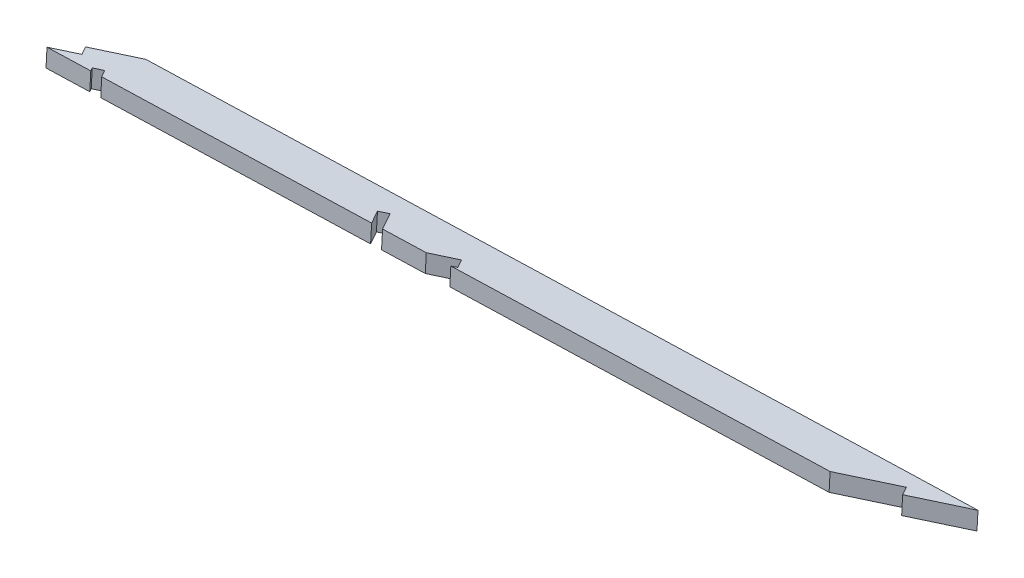
ISO-10303-21;
HEADER;
FILE_DESCRIPTION(('STEP AP214'),'2;1');
FILE_NAME('part.step','',(''),(''),'','','');
FILE_SCHEMA(('AUTOMOTIVE_DESIGN { 1 0 10303 214 1 1 1 1 }'));
ENDSEC;
DATA;
#1=APPLICATION_CONTEXT('core data for automotive mechanical design processes');
#2=APPLICATION_PROTOCOL_DEFINITION('international standard','automotive_design',2000,#1);
#3=PRODUCT_CONTEXT('',#1,'mechanical');
#4=PRODUCT('Part','Part','',(#3));
#5=PRODUCT_RELATED_PRODUCT_CATEGORY('part','',(#4));
#6=PRODUCT_DEFINITION_FORMATION('','',#4);
#7=PRODUCT_DEFINITION_CONTEXT('part definition',#1,'design');
#8=PRODUCT_DEFINITION('design','',#6,#7);
#9=PRODUCT_DEFINITION_SHAPE('','',#8);
#10=(LENGTH_UNIT() NAMED_UNIT(*) SI_UNIT(.MILLI.,.METRE.));
#11=(NAMED_UNIT(*) PLANE_ANGLE_UNIT() SI_UNIT($,.RADIAN.));
#12=(NAMED_UNIT(*) SI_UNIT($,.STERADIAN.) SOLID_ANGLE_UNIT());
#13=UNCERTAINTY_MEASURE_WITH_UNIT(LENGTH_MEASURE(1.E-05),#10,'distance_accuracy_value','');
#14=(GEOMETRIC_REPRESENTATION_CONTEXT(3) GLOBAL_UNCERTAINTY_ASSIGNED_CONTEXT((#13)) GLOBAL_UNIT_ASSIGNED_CONTEXT((#10,
#11,#12)) REPRESENTATION_CONTEXT('',''));
#15=CARTESIAN_POINT('',(0.,0.,0.));
#16=DIRECTION('',(0.,0.,1.));
#17=DIRECTION('',(1.,0.,0.));
#18=AXIS2_PLACEMENT_3D('',#15,#16,#17);
#19=CARTESIAN_POINT('',(-476.829031594388,54.5135369276523,20.0365454704233));
#20=DIRECTION('',(0.874666792562485,-0.0464839809289173,-0.482490664682183));
#21=DIRECTION('',(-0.483012784347191,0.,-0.875613299440554));
#22=AXIS2_PLACEMENT_3D('',#19,#20,#21);
#23=PLANE('',#22);
#24=DIRECTION('',(-0.482064519205945,0.0207217412881315,-0.875890637443242));
#25=VECTOR('',#24,1.);
#26=CARTESIAN_POINT('',(-476.507004486258,60.8553078660013,20.0093442362275));
#27=LINE('',#26,#25);
#28=CARTESIAN_POINT('',(-476.507004486258,60.8553078660013,20.0093442362275));
#29=VERTEX_POINT('',#28);
#30=CARTESIAN_POINT('',(-477.801520862647,60.9109531839537,17.6572632824911));
#31=VERTEX_POINT('',#30);
#32=EDGE_CURVE('E201',#29,#31,#27,.T.);
#33=ORIENTED_EDGE('',*,*,#32,.T.);
#34=DIRECTION('',(0.0507129304142115,0.998704084779364,-0.00428365892847758));
#35=VECTOR('',#34,1.);
#36=CARTESIAN_POINT('',(-478.123547970778,54.5691822456047,17.6844645166869));
#37=LINE('',#36,#35);
#38=CARTESIAN_POINT('',(-478.123547970778,54.5691822456047,17.6844645166869));
#39=VERTEX_POINT('',#38);
#40=EDGE_CURVE('E11',#39,#31,#37,.T.);
#41=ORIENTED_EDGE('',*,*,#40,.F.);
#42=DIRECTION('',(-0.482064519205945,0.0207217412881315,-0.875890637443242));
#43=VECTOR('',#42,1.);
#44=CARTESIAN_POINT('',(-476.829031594388,54.5135369276523,20.0365454704233));
#45=LINE('',#44,#43);
#46=CARTESIAN_POINT('',(-476.829031594388,54.5135369276523,20.0365454704233));
#47=VERTEX_POINT('',#46);
#48=EDGE_CURVE('E239',#47,#39,#45,.T.);
#49=ORIENTED_EDGE('',*,*,#48,.F.);
#50=DIRECTION('',(0.0507129304142115,0.998704084779364,-0.00428365892847758));
#51=VECTOR('',#50,1.);
#52=CARTESIAN_POINT('',(-476.829031594388,54.5135369276523,20.0365454704233));
#53=LINE('',#52,#51);
#54=EDGE_CURVE('E197',#47,#29,#53,.T.);
#55=ORIENTED_EDGE('',*,*,#54,.T.);
#56=EDGE_LOOP('',(#33,#41,#49,#55));
#57=FACE_BOUND('',#56,.T.);
#58=ADVANCED_FACE('F33',(#57),#23,.F.);
#59=CARTESIAN_POINT('',(-478.123547970778,54.5691822456047,17.6844645166869));
#60=DIRECTION('',(-0.482064519205948,0.0207217412881313,-0.87589063744324));
#61=DIRECTION('',(-0.876078747611493,0.,0.482168049525762));
#62=AXIS2_PLACEMENT_3D('',#59,#60,#61);
#63=PLANE('',#62);
#64=DIRECTION('',(-0.874666792562483,0.046483980928915,0.482490664682187));
#65=VECTOR('',#64,1.);
#66=CARTESIAN_POINT('',(-477.801520862647,60.9109531839537,17.6572632824911));
#67=LINE('',#66,#65);
#68=CARTESIAN_POINT('',(-480.578587929033,61.058539823403,19.189171142857));
#69=VERTEX_POINT('',#68);
#70=EDGE_CURVE('E204',#31,#69,#67,.T.);
#71=ORIENTED_EDGE('',*,*,#70,.T.);
#72=DIRECTION('',(0.0507129304142115,0.998704084779364,-0.00428365892847758));
#73=VECTOR('',#72,1.);
#74=CARTESIAN_POINT('',(-480.900615037163,54.716768885054,19.2163723770529));
#75=LINE('',#74,#73);
#76=CARTESIAN_POINT('',(-480.900615037163,54.716768885054,19.2163723770529));
#77=VERTEX_POINT('',#76);
#78=EDGE_CURVE('E41',#77,#69,#75,.T.);
#79=ORIENTED_EDGE('',*,*,#78,.F.);
#80=DIRECTION('',(-0.874666792562483,0.046483980928915,0.482490664682187));
#81=VECTOR('',#80,1.);
#82=CARTESIAN_POINT('',(-478.123547970778,54.5691822456047,17.6844645166869));
#83=LINE('',#82,#81);
#84=EDGE_CURVE('E128',#39,#77,#83,.T.);
#85=ORIENTED_EDGE('',*,*,#84,.F.);
#86=ORIENTED_EDGE('',*,*,#40,.T.);
#87=EDGE_LOOP('',(#71,#79,#85,#86));
#88=FACE_BOUND('',#87,.T.);
#89=ADVANCED_FACE('F357',(#88),#63,.F.);
#90=CARTESIAN_POINT('',(-480.900615037163,54.716768885054,19.2163723770529));
#91=DIRECTION('',(-0.874666792562497,0.0464839809289178,0.482490664682161));
#92=DIRECTION('',(0.483012784347168,0.,0.875613299440567));
#93=AXIS2_PLACEMENT_3D('',#90,#91,#92);
#94=PLANE('',#93);
#95=DIRECTION('',(0.482064519205922,-0.020721741288132,0.875890637443255));
#96=VECTOR('',#95,1.);
#97=CARTESIAN_POINT('',(-480.578587929033,61.058539823403,19.189171142857));
#98=LINE('',#97,#96);
#99=CARTESIAN_POINT('',(-479.966365989642,61.032223211967,20.30155225241));
#100=VERTEX_POINT('',#99);
#101=EDGE_CURVE('E206',#69,#100,#98,.T.);
#102=ORIENTED_EDGE('',*,*,#101,.T.);
#103=DIRECTION('',(0.0507129304142115,0.998704084779364,-0.00428365892847758));
#104=VECTOR('',#103,1.);
#105=CARTESIAN_POINT('',(-480.288393097772,54.6904522736181,20.3287534866058));
#106=LINE('',#105,#104);
#107=CARTESIAN_POINT('',(-480.288393097772,54.6904522736181,20.3287534866058));
#108=VERTEX_POINT('',#107);
#109=EDGE_CURVE('E282',#108,#100,#106,.T.);
#110=ORIENTED_EDGE('',*,*,#109,.F.);
#111=DIRECTION('',(0.482064519205922,-0.020721741288132,0.875890637443255));
#112=VECTOR('',#111,1.);
#113=CARTESIAN_POINT('',(-480.900615037163,54.716768885054,19.2163723770529));
#114=LINE('',#113,#112);
#115=EDGE_CURVE('E290',#77,#108,#114,.T.);
#116=ORIENTED_EDGE('',*,*,#115,.F.);
#117=ORIENTED_EDGE('',*,*,#78,.T.);
#118=EDGE_LOOP('',(#102,#110,#116,#117));
#119=FACE_BOUND('',#118,.T.);
#120=ADVANCED_FACE('F288',(#119),#94,.F.);
#121=CARTESIAN_POINT('',(-480.288393097772,54.6904522736181,20.3287534866058));
#122=DIRECTION('',(-0.0841690332483842,0.,-0.996451490962823));
#123=DIRECTION('',(-0.996451490962823,0.,0.0841690332483842));
#124=AXIS2_PLACEMENT_3D('',#121,#122,#123);
#125=PLANE('',#124);
#126=DIRECTION('',(-0.995160174309058,0.0508935265531112,0.0840599573170965));
#127=VECTOR('',#126,1.);
#128=CARTESIAN_POINT('',(-479.966365989642,61.032223211967,20.30155225241));
#129=LINE('',#128,#127);
#130=CARTESIAN_POINT('',(-493.817067471883,61.7405624942892,21.4715039902972));
#131=VERTEX_POINT('',#130);
#132=EDGE_CURVE('E208',#100,#131,#129,.T.);
#133=ORIENTED_EDGE('',*,*,#132,.T.);
#134=DIRECTION('',(0.0507129304142115,0.998704084779364,-0.00428365892847758));
#135=VECTOR('',#134,1.);
#136=CARTESIAN_POINT('',(-494.139094580013,55.3987915559402,21.4987052244931));
#137=LINE('',#136,#135);
#138=CARTESIAN_POINT('',(-494.139094580013,55.3987915559402,21.4987052244931));
#139=VERTEX_POINT('',#138);
#140=EDGE_CURVE('E279',#139,#131,#137,.T.);
#141=ORIENTED_EDGE('',*,*,#140,.F.);
#142=DIRECTION('',(-0.995160174309058,0.0508935265531112,0.0840599573170965));
#143=VECTOR('',#142,1.);
#144=CARTESIAN_POINT('',(-480.288393097772,54.6904522736181,20.3287534866058));
#145=LINE('',#144,#143);
#146=EDGE_CURVE('E308',#108,#139,#145,.T.);
#147=ORIENTED_EDGE('',*,*,#146,.F.);
#148=ORIENTED_EDGE('',*,*,#109,.T.);
#149=EDGE_LOOP('',(#133,#141,#147,#148));
#150=FACE_BOUND('',#149,.T.);
#151=ADVANCED_FACE('F299',(#150),#125,.F.);
#152=CARTESIAN_POINT('',(-494.139094580013,55.3987915559402,21.4987052244931));
#153=DIRECTION('',(0.482064519205941,-0.0207217412881309,0.875890637443244));
#154=DIRECTION('',(0.876078747611497,0.,-0.482168049525755));
#155=AXIS2_PLACEMENT_3D('',#152,#153,#154);
#156=PLANE('',#155);
#157=DIRECTION('',(0.874666792562487,-0.0464839809289173,-0.48249066468218));
#158=VECTOR('',#157,1.);
#159=CARTESIAN_POINT('',(-493.817067471883,61.7405624942892,21.4715039902972));
#160=LINE('',#159,#158);
#161=CARTESIAN_POINT('',(-486.093084044152,61.3300730354427,17.210738714046));
#162=VERTEX_POINT('',#161);
#163=EDGE_CURVE('E210',#131,#162,#160,.T.);
#164=ORIENTED_EDGE('',*,*,#163,.T.);
#165=DIRECTION('',(0.0507129304142115,0.998704084779364,-0.00428365892847758));
#166=VECTOR('',#165,1.);
#167=CARTESIAN_POINT('',(-486.415111152282,54.9883020970938,17.2379399482418));
#168=LINE('',#167,#166);
#169=CARTESIAN_POINT('',(-486.415111152282,54.9883020970938,17.2379399482418));
#170=VERTEX_POINT('',#169);
#171=EDGE_CURVE('E276',#170,#162,#168,.T.);
#172=ORIENTED_EDGE('',*,*,#171,.F.);
#173=DIRECTION('',(0.874666792562487,-0.0464839809289173,-0.48249066468218));
#174=VECTOR('',#173,1.);
#175=CARTESIAN_POINT('',(-494.139094580013,55.3987915559402,21.4987052244931));
#176=LINE('',#175,#174);
#177=EDGE_CURVE('E305',#139,#170,#176,.T.);
#178=ORIENTED_EDGE('',*,*,#177,.F.);
#179=ORIENTED_EDGE('',*,*,#140,.T.);
#180=EDGE_LOOP('',(#164,#172,#178,#179));
#181=FACE_BOUND('',#180,.T.);
#182=ADVANCED_FACE('F303',(#181),#156,.F.);
#183=CARTESIAN_POINT('',(-486.415111152282,54.9883020970938,17.2379399482418));
#184=DIRECTION('',(0.874666792562486,-0.0464839809289173,-0.482490664682182));
#185=DIRECTION('',(-0.48301278434719,0.,-0.875613299440555));
#186=AXIS2_PLACEMENT_3D('',#183,#184,#185);
#187=PLANE('',#186);
#188=DIRECTION('',(-0.482064519205943,0.0207217412881325,-0.875890637443243));
#189=VECTOR('',#188,1.);
#190=CARTESIAN_POINT('',(-486.093084044152,61.3300730354427,17.210738714046));
#191=LINE('',#190,#189);
#192=CARTESIAN_POINT('',(-487.62363889263,61.3958645640325,14.4297859401637));
#193=VERTEX_POINT('',#192);
#194=EDGE_CURVE('E212',#162,#193,#191,.T.);
#195=ORIENTED_EDGE('',*,*,#194,.T.);
#196=DIRECTION('',(0.0507129304142115,0.998704084779364,-0.00428365892847758));
#197=VECTOR('',#196,1.);
#198=CARTESIAN_POINT('',(-487.945666000761,55.0540936256836,14.4569871743595));
#199=LINE('',#198,#197);
#200=CARTESIAN_POINT('',(-487.945666000761,55.0540936256836,14.4569871743595));
#201=VERTEX_POINT('',#200);
#202=EDGE_CURVE('E273',#201,#193,#199,.T.);
#203=ORIENTED_EDGE('',*,*,#202,.F.);
#204=DIRECTION('',(-0.482064519205943,0.0207217412881325,-0.875890637443243));
#205=VECTOR('',#204,1.);
#206=CARTESIAN_POINT('',(-486.415111152282,54.9883020970938,17.2379399482418));
#207=LINE('',#206,#205);
#208=EDGE_CURVE('E307',#170,#201,#207,.T.);
#209=ORIENTED_EDGE('',*,*,#208,.F.);
#210=ORIENTED_EDGE('',*,*,#171,.T.);
#211=EDGE_LOOP('',(#195,#203,#209,#210));
#212=FACE_BOUND('',#211,.T.);
#213=ADVANCED_FACE('F370',(#212),#187,.F.);
#214=CARTESIAN_POINT('',(-487.945666000761,55.0540936256836,14.4569871743595));
#215=DIRECTION('',(0.482030970264136,-0.0207199583403463,0.875909143137911));
#216=DIRECTION('',(0.876097224899921,0.,-0.482134475559109));
#217=AXIS2_PLACEMENT_3D('',#214,#215,#216);
#218=PLANE('',#217);
#219=DIRECTION('',(0.874685281912883,-0.0464847756946999,-0.482457068798452));
#220=VECTOR('',#219,1.);
#221=CARTESIAN_POINT('',(-487.62363889263,61.3958645640325,14.4297859401637));
#222=LINE('',#221,#220);
#223=CARTESIAN_POINT('',(-474.293435186474,60.6874365819243,7.07714020626748));
#224=VERTEX_POINT('',#223);
#225=EDGE_CURVE('E214',#193,#224,#222,.T.);
#226=ORIENTED_EDGE('',*,*,#225,.T.);
#227=DIRECTION('',(0.0507129304142115,0.998704084779364,-0.00428365892847758));
#228=VECTOR('',#227,1.);
#229=CARTESIAN_POINT('',(-474.615462294604,54.3456656435753,7.10434144046332));
#230=LINE('',#229,#228);
#231=CARTESIAN_POINT('',(-474.615462294604,54.3456656435753,7.10434144046332));
#232=VERTEX_POINT('',#231);
#233=EDGE_CURVE('E270',#232,#224,#230,.T.);
#234=ORIENTED_EDGE('',*,*,#233,.F.);
#235=DIRECTION('',(0.874685281912883,-0.0464847756946999,-0.482457068798452));
#236=VECTOR('',#235,1.);
#237=CARTESIAN_POINT('',(-487.945666000761,55.0540936256836,14.4569871743595));
#238=LINE('',#237,#236);
#239=EDGE_CURVE('E310',#201,#232,#238,.T.);
#240=ORIENTED_EDGE('',*,*,#239,.F.);
#241=ORIENTED_EDGE('',*,*,#202,.T.);
#242=EDGE_LOOP('',(#226,#234,#240,#241));
#243=FACE_BOUND('',#242,.T.);
#244=ADVANCED_FACE('F373',(#243),#218,.F.);
#245=CARTESIAN_POINT('',(-474.615462294604,54.3456656435753,7.10434144046332));
#246=DIRECTION('',(0.084169033251768,-2.72252662951401E-13,0.996451490962537));
#247=DIRECTION('',(0.996451490962537,0.,-0.084169033251768));
#248=AXIS2_PLACEMENT_3D('',#245,#246,#247);
#249=PLANE('',#248);
#250=DIRECTION('',(0.995160174308772,-0.0508935265531107,-0.0840599573204847));
#251=VECTOR('',#250,1.);
#252=CARTESIAN_POINT('',(-474.293435186474,60.6874365819243,7.07714020626748));
#253=LINE('',#252,#251);
#254=CARTESIAN_POINT('',(-210.988565112463,47.221751617207,-15.1638986858593));
#255=VERTEX_POINT('',#254);
#256=EDGE_CURVE('E216',#224,#255,#253,.T.);
#257=ORIENTED_EDGE('',*,*,#256,.T.);
#258=DIRECTION('',(0.0507129304142115,0.998704084779364,-0.00428365892847758));
#259=VECTOR('',#258,1.);
#260=CARTESIAN_POINT('',(-211.310592220593,40.8799806788581,-15.1366974516635));
#261=LINE('',#260,#259);
#262=CARTESIAN_POINT('',(-211.310592220593,40.8799806788581,-15.1366974516635));
#263=VERTEX_POINT('',#262);
#264=EDGE_CURVE('E267',#263,#255,#261,.T.);
#265=ORIENTED_EDGE('',*,*,#264,.F.);
#266=DIRECTION('',(0.995160174308772,-0.0508935265531107,-0.0840599573204847));
#267=VECTOR('',#266,1.);
#268=CARTESIAN_POINT('',(-474.615462294604,54.3456656435753,7.10434144046332));
#269=LINE('',#268,#267);
#270=EDGE_CURVE('E316',#232,#263,#269,.T.);
#271=ORIENTED_EDGE('',*,*,#270,.F.);
#272=ORIENTED_EDGE('',*,*,#233,.T.);
#273=EDGE_LOOP('',(#257,#265,#271,#272));
#274=FACE_BOUND('',#273,.T.);
#275=ADVANCED_FACE('F377',(#274),#249,.F.);
#276=CARTESIAN_POINT('',(-211.310592220593,40.8799806788581,-15.1366974516635));
#277=DIRECTION('',(-0.482031673726719,0.0207199957255664,-0.875908755123129));
#278=DIRECTION('',(-0.876096837480756,0.,0.482135179546378));
#279=AXIS2_PLACEMENT_3D('',#276,#277,#278);
#280=PLANE('',#279);
#281=DIRECTION('',(-0.87468489424079,0.0464847590307264,0.482457773245322));
#282=VECTOR('',#281,1.);
#283=CARTESIAN_POINT('',(-210.988565112463,47.221751617207,-15.1638986858593));
#284=LINE('',#283,#282);
#285=CARTESIAN_POINT('',(-227.65131234775,48.1072862767424,-5.97307810553605));
#286=VERTEX_POINT('',#285);
#287=EDGE_CURVE('E218',#255,#286,#284,.T.);
#288=ORIENTED_EDGE('',*,*,#287,.T.);
#289=DIRECTION('',(0.0507129304142115,0.998704084779364,-0.00428365892847758));
#290=VECTOR('',#289,1.);
#291=CARTESIAN_POINT('',(-227.97333945588,41.7655153383934,-5.94587687134022));
#292=LINE('',#291,#290);
#293=CARTESIAN_POINT('',(-227.97333945588,41.7655153383934,-5.94587687134022));
#294=VERTEX_POINT('',#293);
#295=EDGE_CURVE('E264',#294,#286,#292,.T.);
#296=ORIENTED_EDGE('',*,*,#295,.F.);
#297=DIRECTION('',(-0.87468489424079,0.0464847590307264,0.482457773245322));
#298=VECTOR('',#297,1.);
#299=CARTESIAN_POINT('',(-211.310592220593,40.8799806788581,-15.1366974516635));
#300=LINE('',#299,#298);
#301=EDGE_CURVE('E318',#263,#294,#300,.T.);
#302=ORIENTED_EDGE('',*,*,#301,.F.);
#303=ORIENTED_EDGE('',*,*,#264,.T.);
#304=EDGE_LOOP('',(#288,#296,#302,#303));
#305=FACE_BOUND('',#304,.T.);
#306=ADVANCED_FACE('F381',(#305),#280,.F.);
#307=CARTESIAN_POINT('',(-227.97333945588,41.7655153383934,-5.94587687134022));
#308=DIRECTION('',(0.874684894240787,-0.0464847590307262,-0.482457773245326));
#309=DIRECTION('',(-0.482979874824389,0.,-0.8756314524471));
#310=AXIS2_PLACEMENT_3D('',#307,#308,#309);
#311=PLANE('',#310);
#312=DIRECTION('',(-0.482031673726724,0.0207199957255664,-0.875908755123127));
#313=VECTOR('',#312,1.);
#314=CARTESIAN_POINT('',(-227.65131234775,48.1072862767424,-5.97307810553605));
#315=LINE('',#314,#313);
#316=CARTESIAN_POINT('',(-229.181762911832,48.173072263171,-8.75408840305199));
#317=VERTEX_POINT('',#316);
#318=EDGE_CURVE('E220',#286,#317,#315,.T.);
#319=ORIENTED_EDGE('',*,*,#318,.T.);
#320=DIRECTION('',(0.0507129304142115,0.998704084779364,-0.00428365892847758));
#321=VECTOR('',#320,1.);
#322=CARTESIAN_POINT('',(-229.503790019963,41.8313013248221,-8.72688716885616));
#323=LINE('',#322,#321);
#324=CARTESIAN_POINT('',(-229.503790019963,41.8313013248221,-8.72688716885616));
#325=VERTEX_POINT('',#324);
#326=EDGE_CURVE('E261',#325,#317,#323,.T.);
#327=ORIENTED_EDGE('',*,*,#326,.F.);
#328=DIRECTION('',(-0.482031673726724,0.0207199957255664,-0.875908755123127));
#329=VECTOR('',#328,1.);
#330=CARTESIAN_POINT('',(-227.97333945588,41.7655153383934,-5.94587687134022));
#331=LINE('',#330,#329);
#332=EDGE_CURVE('E320',#294,#325,#331,.T.);
#333=ORIENTED_EDGE('',*,*,#332,.F.);
#334=ORIENTED_EDGE('',*,*,#295,.T.);
#335=EDGE_LOOP('',(#319,#327,#333,#334));
#336=FACE_BOUND('',#335,.T.);
#337=ADVANCED_FACE('F385',(#336),#311,.F.);
#338=CARTESIAN_POINT('',(-229.503790019963,41.8313013248221,-8.72688716885616));
#339=DIRECTION('',(-0.482031673726722,0.0207199957255665,-0.875908755123128));
#340=DIRECTION('',(-0.876096837480755,0.,0.482135179546381));
#341=AXIS2_PLACEMENT_3D('',#338,#339,#340);
#342=PLANE('',#341);
#343=DIRECTION('',(-0.874684894240788,0.0464847590307265,0.482457773245324));
#344=VECTOR('',#343,1.);
#345=CARTESIAN_POINT('',(-229.181762911832,48.173072263171,-8.75408840305199));
#346=LINE('',#345,#344);
#347=CARTESIAN_POINT('',(-246.034689140757,49.0687139049467,0.541630906394031));
#348=VERTEX_POINT('',#347);
#349=EDGE_CURVE('E222',#317,#348,#346,.T.);
#350=ORIENTED_EDGE('',*,*,#349,.T.);
#351=DIRECTION('',(0.0507129304142115,0.998704084779364,-0.00428365892847758));
#352=VECTOR('',#351,1.);
#353=CARTESIAN_POINT('',(-246.356716248887,42.7269429665977,0.568832140589863));
#354=LINE('',#353,#352);
#355=CARTESIAN_POINT('',(-246.356716248887,42.7269429665977,0.568832140589863));
#356=VERTEX_POINT('',#355);
#357=EDGE_CURVE('E258',#356,#348,#354,.T.);
#358=ORIENTED_EDGE('',*,*,#357,.F.);
#359=DIRECTION('',(-0.874684894240788,0.0464847590307265,0.482457773245324));
#360=VECTOR('',#359,1.);
#361=CARTESIAN_POINT('',(-229.503790019963,41.8313013248221,-8.72688716885616));
#362=LINE('',#361,#360);
#363=EDGE_CURVE('E322',#325,#356,#362,.T.);
#364=ORIENTED_EDGE('',*,*,#363,.F.);
#365=ORIENTED_EDGE('',*,*,#326,.T.);
#366=EDGE_LOOP('',(#350,#358,#364,#365));
#367=FACE_BOUND('',#366,.T.);
#368=ADVANCED_FACE('F389',(#367),#342,.F.);
#369=CARTESIAN_POINT('',(-246.356716248887,42.7269429665977,0.568832140589863));
#370=DIRECTION('',(-0.0841690332483866,0.,-0.996451490962823));
#371=DIRECTION('',(-0.996451490962823,0.,0.0841690332483866));
#372=AXIS2_PLACEMENT_3D('',#369,#370,#371);
#373=PLANE('',#372);
#374=DIRECTION('',(-0.995160174309058,0.0508935265531106,0.0840599573170989));
#375=VECTOR('',#374,1.);
#376=CARTESIAN_POINT('',(-246.034689140757,49.0687139049467,0.541630906394031));
#377=LINE('',#376,#375);
#378=CARTESIAN_POINT('',(-366.045630404713,55.20619828541,10.6788076751862));
#379=VERTEX_POINT('',#378);
#380=EDGE_CURVE('E224',#348,#379,#377,.T.);
#381=ORIENTED_EDGE('',*,*,#380,.T.);
#382=DIRECTION('',(0.0507129304142115,0.998704084779364,-0.00428365892847758));
#383=VECTOR('',#382,1.);
#384=CARTESIAN_POINT('',(-366.367657512843,48.864427347061,10.7060089093821));
#385=LINE('',#384,#383);
#386=CARTESIAN_POINT('',(-366.367657512843,48.864427347061,10.7060089093821));
#387=VERTEX_POINT('',#386);
#388=EDGE_CURVE('E255',#387,#379,#385,.T.);
#389=ORIENTED_EDGE('',*,*,#388,.F.);
#390=DIRECTION('',(-0.995160174309058,0.0508935265531106,0.0840599573170989));
#391=VECTOR('',#390,1.);
#392=CARTESIAN_POINT('',(-246.356716248887,42.7269429665977,0.568832140589863));
#393=LINE('',#392,#391);
#394=EDGE_CURVE('E324',#356,#387,#393,.T.);
#395=ORIENTED_EDGE('',*,*,#394,.F.);
#396=ORIENTED_EDGE('',*,*,#357,.T.);
#397=EDGE_LOOP('',(#381,#389,#395,#396));
#398=FACE_BOUND('',#397,.T.);
#399=ADVANCED_FACE('F393',(#398),#373,.F.);
#400=CARTESIAN_POINT('',(-366.367657512843,48.864427347061,10.7060089093821));
#401=DIRECTION('',(0.482064519205951,-0.0207217412881314,0.875890637443239));
#402=DIRECTION('',(0.876078747611492,0.,-0.482168049525765));
#403=AXIS2_PLACEMENT_3D('',#400,#401,#402);
#404=PLANE('',#403);
#405=DIRECTION('',(0.874666792562481,-0.0464839809289171,-0.48249066468219));
#406=VECTOR('',#405,1.);
#407=CARTESIAN_POINT('',(-366.045630404713,55.20619828541,10.6788076751862));
#408=LINE('',#407,#406);
#409=CARTESIAN_POINT('',(-364.499489575521,55.1240289594121,9.82591315270896));
#410=VERTEX_POINT('',#409);
#411=EDGE_CURVE('E226',#379,#410,#408,.T.);
#412=ORIENTED_EDGE('',*,*,#411,.T.);
#413=DIRECTION('',(0.0507129304142115,0.998704084779364,-0.00428365892847758));
#414=VECTOR('',#413,1.);
#415=CARTESIAN_POINT('',(-364.821516683651,48.7822580210631,9.85311438690479));
#416=LINE('',#415,#414);
#417=CARTESIAN_POINT('',(-364.821516683651,48.7822580210631,9.85311438690479));
#418=VERTEX_POINT('',#417);
#419=EDGE_CURVE('E252',#418,#410,#416,.T.);
#420=ORIENTED_EDGE('',*,*,#419,.F.);
#421=DIRECTION('',(0.874666792562481,-0.0464839809289171,-0.48249066468219));
#422=VECTOR('',#421,1.);
#423=CARTESIAN_POINT('',(-366.367657512843,48.864427347061,10.7060089093821));
#424=LINE('',#423,#422);
#425=EDGE_CURVE('E326',#387,#418,#424,.T.);
#426=ORIENTED_EDGE('',*,*,#425,.F.);
#427=ORIENTED_EDGE('',*,*,#388,.T.);
#428=EDGE_LOOP('',(#412,#420,#426,#427));
#429=FACE_BOUND('',#428,.T.);
#430=ADVANCED_FACE('F397',(#429),#404,.F.);
#431=CARTESIAN_POINT('',(-364.821516683651,48.7822580210631,9.85311438690479));
#432=DIRECTION('',(0.874666792562482,-0.0464839809289172,-0.482490664682189));
#433=DIRECTION('',(-0.483012784347197,0.,-0.875613299440551));
#434=AXIS2_PLACEMENT_3D('',#431,#432,#433);
#435=PLANE('',#434);
#436=DIRECTION('',(-0.48206451920595,0.0207217412881328,-0.875890637443239));
#437=VECTOR('',#436,1.);
#438=CARTESIAN_POINT('',(-364.499489575521,55.1240289594121,9.82591315270896));
#439=LINE('',#438,#437);
#440=CARTESIAN_POINT('',(-366.030044424,55.1898204880019,7.04496037882674));
#441=VERTEX_POINT('',#440);
#442=EDGE_CURVE('E228',#410,#441,#439,.T.);
#443=ORIENTED_EDGE('',*,*,#442,.T.);
#444=DIRECTION('',(0.0507129304142115,0.998704084779364,-0.00428365892847758));
#445=VECTOR('',#444,1.);
#446=CARTESIAN_POINT('',(-366.35207153213,48.8480495496529,7.07216161302257));
#447=LINE('',#446,#445);
#448=CARTESIAN_POINT('',(-366.35207153213,48.8480495496529,7.07216161302257));
#449=VERTEX_POINT('',#448);
#450=EDGE_CURVE('E249',#449,#441,#447,.T.);
#451=ORIENTED_EDGE('',*,*,#450,.F.);
#452=DIRECTION('',(-0.48206451920595,0.0207217412881328,-0.875890637443239));
#453=VECTOR('',#452,1.);
#454=CARTESIAN_POINT('',(-364.821516683651,48.7822580210631,9.85311438690479));
#455=LINE('',#454,#453);
#456=EDGE_CURVE('E328',#418,#449,#455,.T.);
#457=ORIENTED_EDGE('',*,*,#456,.F.);
#458=ORIENTED_EDGE('',*,*,#419,.T.);
#459=EDGE_LOOP('',(#443,#451,#457,#458));
#460=FACE_BOUND('',#459,.T.);
#461=ADVANCED_FACE('F401',(#460),#435,.F.);
#462=CARTESIAN_POINT('',(-366.35207153213,48.8480495496529,7.07216161302257));
#463=DIRECTION('',(-0.482064519205936,0.0207217412881306,-0.875890637443247));
#464=DIRECTION('',(-0.8760787476115,0.,0.48216804952575));
#465=AXIS2_PLACEMENT_3D('',#462,#463,#464);
#466=PLANE('',#465);
#467=DIRECTION('',(-0.87466679256249,0.0464839809289169,0.482490664682175));
#468=VECTOR('',#467,1.);
#469=CARTESIAN_POINT('',(-366.030044424,55.1898204880019,7.04496037882674));
#470=LINE('',#469,#468);
#471=CARTESIAN_POINT('',(-373.80583220988,55.60306307846,11.3343023878513));
#472=VERTEX_POINT('',#471);
#473=EDGE_CURVE('E230',#441,#472,#470,.T.);
#474=ORIENTED_EDGE('',*,*,#473,.T.);
#475=DIRECTION('',(0.0507129304142115,0.998704084779364,-0.00428365892847758));
#476=VECTOR('',#475,1.);
#477=CARTESIAN_POINT('',(-374.12785931801,49.261292140111,11.3615036220471));
#478=LINE('',#477,#476);
#479=CARTESIAN_POINT('',(-374.12785931801,49.261292140111,11.3615036220471));
#480=VERTEX_POINT('',#479);
#481=EDGE_CURVE('E246',#480,#472,#478,.T.);
#482=ORIENTED_EDGE('',*,*,#481,.F.);
#483=DIRECTION('',(-0.87466679256249,0.0464839809289169,0.482490664682175));
#484=VECTOR('',#483,1.);
#485=CARTESIAN_POINT('',(-366.35207153213,48.8480495496529,7.07216161302257));
#486=LINE('',#485,#484);
#487=EDGE_CURVE('E330',#449,#480,#486,.T.);
#488=ORIENTED_EDGE('',*,*,#487,.F.);
#489=ORIENTED_EDGE('',*,*,#450,.T.);
#490=EDGE_LOOP('',(#474,#482,#488,#489));
#491=FACE_BOUND('',#490,.T.);
#492=ADVANCED_FACE('F405',(#491),#466,.F.);
#493=CARTESIAN_POINT('',(-374.12785931801,49.261292140111,11.3615036220471));
#494=DIRECTION('',(-0.0841690332483885,0.,-0.996451490962822));
#495=DIRECTION('',(-0.996451490962822,0.,0.0841690332483885));
#496=AXIS2_PLACEMENT_3D('',#493,#494,#495);
#497=PLANE('',#496);
#498=DIRECTION('',(-0.995160174309058,0.0508935265531109,0.0840599573171008));
#499=VECTOR('',#498,1.);
#500=CARTESIAN_POINT('',(-373.80583220988,55.60306307846,11.3343023878513));
#501=LINE('',#500,#499);
#502=CARTESIAN_POINT('',(-387.643278223415,56.3107244623231,12.503134452582));
#503=VERTEX_POINT('',#502);
#504=EDGE_CURVE('E232',#472,#503,#501,.T.);
#505=ORIENTED_EDGE('',*,*,#504,.T.);
#506=DIRECTION('',(0.0507129304142115,0.998704084779364,-0.00428365892847758));
#507=VECTOR('',#506,1.);
#508=CARTESIAN_POINT('',(-387.965305331545,49.9689535239742,12.5303356867778));
#509=LINE('',#508,#507);
#510=CARTESIAN_POINT('',(-387.965305331545,49.9689535239742,12.5303356867778));
#511=VERTEX_POINT('',#510);
#512=EDGE_CURVE('E243',#511,#503,#509,.T.);
#513=ORIENTED_EDGE('',*,*,#512,.F.);
#514=DIRECTION('',(-0.995160174309058,0.0508935265531109,0.0840599573171008));
#515=VECTOR('',#514,1.);
#516=CARTESIAN_POINT('',(-374.12785931801,49.261292140111,11.3615036220471));
#517=LINE('',#516,#515);
#518=EDGE_CURVE('E332',#480,#511,#517,.T.);
#519=ORIENTED_EDGE('',*,*,#518,.F.);
#520=ORIENTED_EDGE('',*,*,#481,.T.);
#521=EDGE_LOOP('',(#505,#513,#519,#520));
#522=FACE_BOUND('',#521,.T.);
#523=ADVANCED_FACE('F338',(#522),#497,.F.);
#524=CARTESIAN_POINT('',(-387.965305331545,49.9689535239742,12.5303356867778));
#525=DIRECTION('',(0.874666792562481,-0.0464839809289171,-0.482490664682191));
#526=DIRECTION('',(-0.483012784347199,0.,-0.87561329944055));
#527=AXIS2_PLACEMENT_3D('',#524,#525,#526);
#528=PLANE('',#527);
#529=DIRECTION('',(-0.482064519205952,0.0207217412881312,-0.875890637443238));
#530=VECTOR('',#529,1.);
#531=CARTESIAN_POINT('',(-387.643278223415,56.3107244623231,12.503134452582));
#532=LINE('',#531,#530);
#533=CARTESIAN_POINT('',(-390.774460417979,56.4453196145833,6.81391017018697));
#534=VERTEX_POINT('',#533);
#535=EDGE_CURVE('E234',#503,#534,#532,.T.);
#536=ORIENTED_EDGE('',*,*,#535,.T.);
#537=DIRECTION('',(0.0507129304142115,0.998704084779364,-0.00428365892847758));
#538=VECTOR('',#537,1.);
#539=CARTESIAN_POINT('',(-391.096487526109,50.1035486762343,6.8411114043828));
#540=LINE('',#539,#538);
#541=CARTESIAN_POINT('',(-391.096487526109,50.1035486762343,6.8411114043828));
#542=VERTEX_POINT('',#541);
#543=EDGE_CURVE('E192',#542,#534,#540,.T.);
#544=ORIENTED_EDGE('',*,*,#543,.F.);
#545=DIRECTION('',(-0.482064519205952,0.0207217412881312,-0.875890637443238));
#546=VECTOR('',#545,1.);
#547=CARTESIAN_POINT('',(-387.965305331545,49.9689535239742,12.5303356867778));
#548=LINE('',#547,#546);
#549=EDGE_CURVE('E183',#511,#542,#548,.T.);
#550=ORIENTED_EDGE('',*,*,#549,.F.);
#551=ORIENTED_EDGE('',*,*,#512,.T.);
#552=EDGE_LOOP('',(#536,#544,#550,#551));
#553=FACE_BOUND('',#552,.T.);
#554=ADVANCED_FACE('F342',(#553),#528,.F.);
#555=CARTESIAN_POINT('',(-391.096487526109,50.1035486762343,6.8411114043828));
#556=DIRECTION('',(-0.482064519205977,0.0207217412881328,-0.875890637443224));
#557=DIRECTION('',(-0.876078747611477,0.,0.482168049525791));
#558=AXIS2_PLACEMENT_3D('',#555,#556,#557);
#559=PLANE('',#558);
#560=DIRECTION('',(-0.874666792562467,0.046483980928917,0.482490664682216));
#561=VECTOR('',#560,1.);
#562=CARTESIAN_POINT('',(-390.774460417979,56.4453196145833,6.81391017018697));
#563=LINE('',#562,#561);
#564=CARTESIAN_POINT('',(-393.551527484364,56.5929062540326,8.34581803055293));
#565=VERTEX_POINT('',#564);
#566=EDGE_CURVE('E191',#534,#565,#563,.T.);
#567=ORIENTED_EDGE('',*,*,#566,.T.);
#568=DIRECTION('',(0.0507129304142115,0.998704084779364,-0.00428365892847758));
#569=VECTOR('',#568,1.);
#570=CARTESIAN_POINT('',(-393.873554592494,50.2511353156836,8.37301926474876));
#571=LINE('',#570,#569);
#572=CARTESIAN_POINT('',(-393.873554592494,50.2511353156836,8.37301926474876));
#573=VERTEX_POINT('',#572);
#574=EDGE_CURVE('E188',#573,#565,#571,.T.);
#575=ORIENTED_EDGE('',*,*,#574,.F.);
#576=DIRECTION('',(-0.874666792562467,0.046483980928917,0.482490664682216));
#577=VECTOR('',#576,1.);
#578=CARTESIAN_POINT('',(-391.096487526109,50.1035486762343,6.8411114043828));
#579=LINE('',#578,#577);
#580=EDGE_CURVE('E177',#542,#573,#579,.T.);
#581=ORIENTED_EDGE('',*,*,#580,.F.);
#582=ORIENTED_EDGE('',*,*,#543,.T.);
#583=EDGE_LOOP('',(#567,#575,#581,#582));
#584=FACE_BOUND('',#583,.T.);
#585=ADVANCED_FACE('F189',(#584),#559,.F.);
#586=CARTESIAN_POINT('',(-393.873554592494,50.2511353156836,8.37301926474876));
#587=DIRECTION('',(-0.874666792562492,0.0464839809289176,0.48249066468217));
#588=DIRECTION('',(0.483012784347178,0.,0.875613299440562));
#589=AXIS2_PLACEMENT_3D('',#586,#587,#588);
#590=PLANE('',#589);
#591=DIRECTION('',(0.482064519205931,-0.0207217412881296,0.87589063744325));
#592=VECTOR('',#591,1.);
#593=CARTESIAN_POINT('',(-393.551527484364,56.5929062540326,8.34581803055293));
#594=LINE('',#593,#592);
#595=CARTESIAN_POINT('',(-391.102639726798,56.4876398082889,12.7953424687646));
#596=VERTEX_POINT('',#595);
#597=EDGE_CURVE('E114',#565,#596,#594,.T.);
#598=ORIENTED_EDGE('',*,*,#597,.T.);
#599=DIRECTION('',(0.0507129304142115,0.998704084779364,-0.00428365892847758));
#600=VECTOR('',#599,1.);
#601=CARTESIAN_POINT('',(-391.424666834928,50.14586886994,12.8225437029605));
#602=LINE('',#601,#600);
#603=CARTESIAN_POINT('',(-391.424666834928,50.14586886994,12.8225437029605));
#604=VERTEX_POINT('',#603);
#605=EDGE_CURVE('E193',#604,#596,#602,.T.);
#606=ORIENTED_EDGE('',*,*,#605,.F.);
#607=DIRECTION('',(0.482064519205931,-0.0207217412881296,0.87589063744325));
#608=VECTOR('',#607,1.);
#609=CARTESIAN_POINT('',(-393.873554592494,50.2511353156836,8.37301926474876));
#610=LINE('',#609,#608);
#611=EDGE_CURVE('E181',#573,#604,#610,.T.);
#612=ORIENTED_EDGE('',*,*,#611,.F.);
#613=ORIENTED_EDGE('',*,*,#574,.T.);
#614=EDGE_LOOP('',(#598,#606,#612,#613));
#615=FACE_BOUND('',#614,.T.);
#616=ADVANCED_FACE('F195',(#615),#590,.F.);
#617=CARTESIAN_POINT('',(-391.424666834928,50.14586886994,12.8225437029605));
#618=DIRECTION('',(-0.0841690332483867,0.,-0.996451490962823));
#619=DIRECTION('',(-0.996451490962823,0.,0.0841690332483867));
#620=AXIS2_PLACEMENT_3D('',#617,#618,#619);
#621=PLANE('',#620);
#622=DIRECTION('',(-0.995160174309058,0.0508935265531107,0.0840599573170989));
#623=VECTOR('',#622,1.);
#624=CARTESIAN_POINT('',(-391.102639726798,56.4876398082889,12.7953424687646));
#625=LINE('',#624,#623);
#626=EDGE_CURVE('E120',#596,#29,#625,.T.);
#627=ORIENTED_EDGE('',*,*,#626,.T.);
#628=ORIENTED_EDGE('',*,*,#54,.F.);
#629=DIRECTION('',(-0.995160174309058,0.0508935265531107,0.0840599573170989));
#630=VECTOR('',#629,1.);
#631=CARTESIAN_POINT('',(-391.424666834928,50.14586886994,12.8225437029605));
#632=LINE('',#631,#630);
#633=EDGE_CURVE('E49',#604,#47,#632,.T.);
#634=ORIENTED_EDGE('',*,*,#633,.F.);
#635=ORIENTED_EDGE('',*,*,#605,.T.);
#636=EDGE_LOOP('',(#627,#628,#634,#635));
#637=FACE_BOUND('',#636,.T.);
#638=ADVANCED_FACE('F346',(#637),#621,.F.);
#639=CARTESIAN_POINT('',(1.53029638818029,30.1365596765147,-0.129262255856666));
#640=DIRECTION('',(0.0507129304142098,0.998704084779364,-0.00428365892847616));
#641=DIRECTION('',(-0.998713247882528,0.0507133957050003,0.));
#642=AXIS2_PLACEMENT_3D('',#639,#640,#641);
#643=PLANE('',#642);
#644=ORIENTED_EDGE('',*,*,#48,.T.);
#645=ORIENTED_EDGE('',*,*,#84,.T.);
#646=ORIENTED_EDGE('',*,*,#115,.T.);
#647=ORIENTED_EDGE('',*,*,#146,.T.);
#648=ORIENTED_EDGE('',*,*,#177,.T.);
#649=ORIENTED_EDGE('',*,*,#208,.T.);
#650=ORIENTED_EDGE('',*,*,#239,.T.);
#651=ORIENTED_EDGE('',*,*,#270,.T.);
#652=ORIENTED_EDGE('',*,*,#301,.T.);
#653=ORIENTED_EDGE('',*,*,#332,.T.);
#654=ORIENTED_EDGE('',*,*,#363,.T.);
#655=ORIENTED_EDGE('',*,*,#394,.T.);
#656=ORIENTED_EDGE('',*,*,#425,.T.);
#657=ORIENTED_EDGE('',*,*,#456,.T.);
#658=ORIENTED_EDGE('',*,*,#487,.T.);
#659=ORIENTED_EDGE('',*,*,#518,.T.);
#660=ORIENTED_EDGE('',*,*,#549,.T.);
#661=ORIENTED_EDGE('',*,*,#580,.T.);
#662=ORIENTED_EDGE('',*,*,#611,.T.);
#663=ORIENTED_EDGE('',*,*,#633,.T.);
#664=EDGE_LOOP('',(#644,#645,#646,#647,#648,#649,#650,#651,#652,#653,#654,#655,#656,#657,#658,
#659,#660,#661,#662,#663));
#665=FACE_BOUND('',#664,.T.);
#666=ADVANCED_FACE('F179',(#665),#643,.F.);
#667=CARTESIAN_POINT('',(1.85232349631053,36.4783306148637,-0.156463490052499));
#668=DIRECTION('',(0.0507129304142098,0.998704084779364,-0.00428365892847616));
#669=DIRECTION('',(-0.998713247882528,0.0507133957050003,0.));
#670=AXIS2_PLACEMENT_3D('',#667,#668,#669);
#671=PLANE('',#670);
#672=ORIENTED_EDGE('',*,*,#32,.F.);
#673=ORIENTED_EDGE('',*,*,#626,.F.);
#674=ORIENTED_EDGE('',*,*,#597,.F.);
#675=ORIENTED_EDGE('',*,*,#566,.F.);
#676=ORIENTED_EDGE('',*,*,#535,.F.);
#677=ORIENTED_EDGE('',*,*,#504,.F.);
#678=ORIENTED_EDGE('',*,*,#473,.F.);
#679=ORIENTED_EDGE('',*,*,#442,.F.);
#680=ORIENTED_EDGE('',*,*,#411,.F.);
#681=ORIENTED_EDGE('',*,*,#380,.F.);
#682=ORIENTED_EDGE('',*,*,#349,.F.);
#683=ORIENTED_EDGE('',*,*,#318,.F.);
#684=ORIENTED_EDGE('',*,*,#287,.F.);
#685=ORIENTED_EDGE('',*,*,#256,.F.);
#686=ORIENTED_EDGE('',*,*,#225,.F.);
#687=ORIENTED_EDGE('',*,*,#194,.F.);
#688=ORIENTED_EDGE('',*,*,#163,.F.);
#689=ORIENTED_EDGE('',*,*,#132,.F.);
#690=ORIENTED_EDGE('',*,*,#101,.F.);
#691=ORIENTED_EDGE('',*,*,#70,.F.);
#692=EDGE_LOOP('',(#672,#673,#674,#675,#676,#677,#678,#679,#680,#681,#682,#683,#684,#685,#686,
#687,#688,#689,#690,#691));
#693=FACE_BOUND('',#692,.T.);
#694=ADVANCED_FACE('F294',(#693),#671,.T.);
#695=CLOSED_SHELL('',(#58,#89,#120,#151,#182,#213,#244,#275,#306,#337,#368,#399,#430,#461,#492,
#523,#554,#585,#616,#638,#666,#694));
#696=MANIFOLD_SOLID_BREP('B2',#695);
#697=ADVANCED_BREP_SHAPE_REPRESENTATION('',(#18,#696),#14);
#698=SHAPE_DEFINITION_REPRESENTATION(#9,#697);
ENDSEC;
END-ISO-10303-21;
